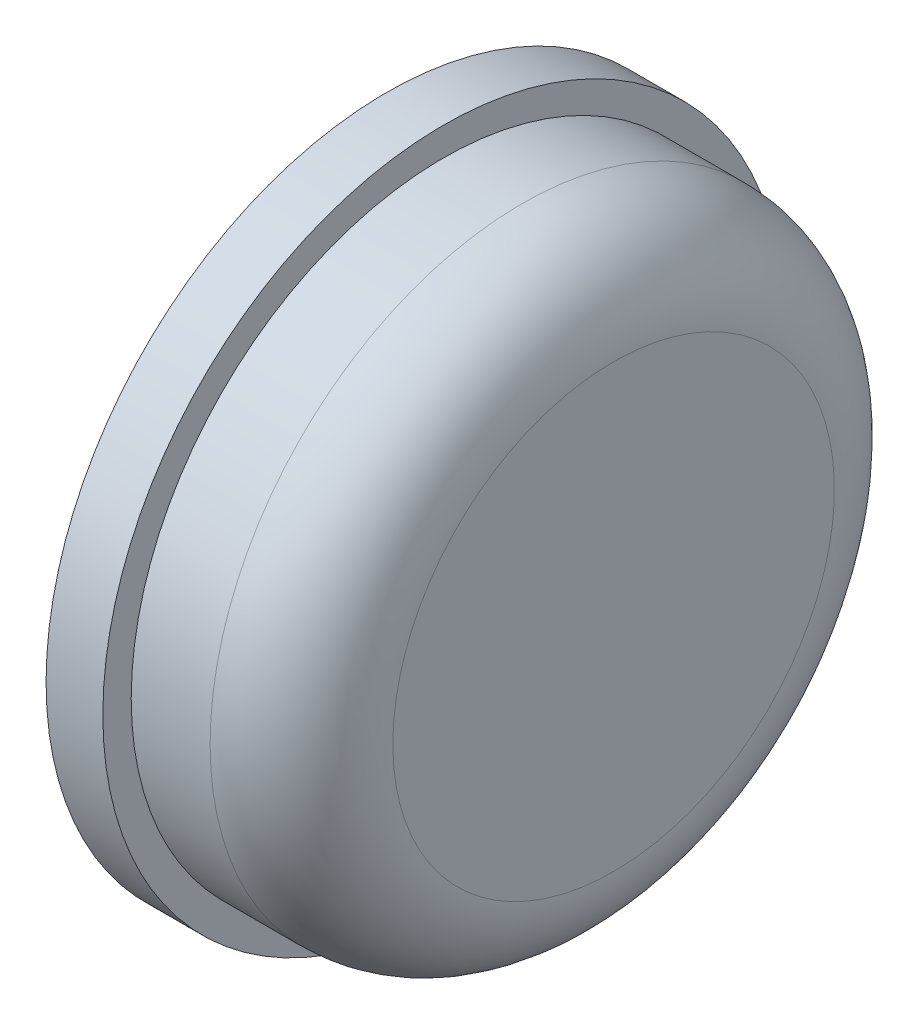
ISO-10303-21;
HEADER;
FILE_DESCRIPTION(('STEP AP214'),'2;1');
FILE_NAME('part.step','',(''),(''),'','','');
FILE_SCHEMA(('AUTOMOTIVE_DESIGN { 1 0 10303 214 1 1 1 1 }'));
ENDSEC;
DATA;
#1=APPLICATION_CONTEXT('core data for automotive mechanical design processes');
#2=APPLICATION_PROTOCOL_DEFINITION('international standard','automotive_design',2000,#1);
#3=PRODUCT_CONTEXT('',#1,'mechanical');
#4=PRODUCT('Part','Part','',(#3));
#5=PRODUCT_RELATED_PRODUCT_CATEGORY('part','',(#4));
#6=PRODUCT_DEFINITION_FORMATION('','',#4);
#7=PRODUCT_DEFINITION_CONTEXT('part definition',#1,'design');
#8=PRODUCT_DEFINITION('design','',#6,#7);
#9=PRODUCT_DEFINITION_SHAPE('','',#8);
#10=(LENGTH_UNIT() NAMED_UNIT(*) SI_UNIT(.MILLI.,.METRE.));
#11=(NAMED_UNIT(*) PLANE_ANGLE_UNIT() SI_UNIT($,.RADIAN.));
#12=(NAMED_UNIT(*) SI_UNIT($,.STERADIAN.) SOLID_ANGLE_UNIT());
#13=UNCERTAINTY_MEASURE_WITH_UNIT(LENGTH_MEASURE(1.E-05),#10,'distance_accuracy_value','');
#14=(GEOMETRIC_REPRESENTATION_CONTEXT(3) GLOBAL_UNCERTAINTY_ASSIGNED_CONTEXT((#13)) GLOBAL_UNIT_ASSIGNED_CONTEXT((#10,
#11,#12)) REPRESENTATION_CONTEXT('',''));
#15=CARTESIAN_POINT('',(0.,0.,0.));
#16=DIRECTION('',(0.,0.,1.));
#17=DIRECTION('',(1.,0.,0.));
#18=AXIS2_PLACEMENT_3D('',#15,#16,#17);
#19=CARTESIAN_POINT('',(-10.5400297619168,0.,0.));
#20=DIRECTION('',(-1.,0.,0.));
#21=DIRECTION('',(0.,0.,1.));
#22=AXIS2_PLACEMENT_3D('',#19,#20,#21);
#23=CONICAL_SURFACE('',#22,8.28554733064869,1.20615294649828);
#24=CARTESIAN_POINT('',(-9.7525545628137,0.,0.));
#25=DIRECTION('',(-1.,0.,0.));
#26=DIRECTION('',(0.,0.,1.));
#27=AXIS2_PLACEMENT_3D('',#24,#25,#26);
#28=CIRCLE('',#27,6.22254625670181);
#29=CARTESIAN_POINT('',(-9.7525545628137,0.,6.22254625670181));
#30=VERTEX_POINT('',#29);
#31=EDGE_CURVE('E10',#30,#30,#28,.T.);
#32=ORIENTED_EDGE('',*,*,#31,.F.);
#33=EDGE_LOOP('',(#32));
#34=FACE_BOUND('',#33,.T.);
#35=CARTESIAN_POINT('',(-10.5400297619168,0.,0.));
#36=DIRECTION('',(-1.,0.,0.));
#37=DIRECTION('',(0.,0.,1.));
#38=AXIS2_PLACEMENT_3D('',#35,#36,#37);
#39=CIRCLE('',#38,8.28554733064869);
#40=CARTESIAN_POINT('',(-10.5400297619168,0.,8.28554733064869));
#41=VERTEX_POINT('',#40);
#42=EDGE_CURVE('E63',#41,#41,#39,.T.);
#43=ORIENTED_EDGE('',*,*,#42,.T.);
#44=EDGE_LOOP('',(#43));
#45=FACE_BOUND('',#44,.T.);
#46=ADVANCED_FACE('F32',(#34,#45),#23,.F.);
#47=CARTESIAN_POINT('',(-17.5979624011993,0.,0.));
#48=DIRECTION('',(-1.,0.,0.));
#49=DIRECTION('',(0.,0.,-1.));
#50=AXIS2_PLACEMENT_3D('',#47,#48,#49);
#51=SPHERICAL_SURFACE('',#50,10.0135161690285);
#52=ORIENTED_EDGE('',*,*,#31,.T.);
#53=EDGE_LOOP('',(#52));
#54=FACE_BOUND('',#53,.T.);
#55=ADVANCED_FACE('F92',(#54),#51,.F.);
#56=CARTESIAN_POINT('',(-2.83902439024601,0.,0.));
#57=DIRECTION('',(1.,0.,0.));
#58=DIRECTION('',(0.,0.,-1.));
#59=AXIS2_PLACEMENT_3D('',#56,#57,#58);
#60=PLANE('',#59);
#61=CARTESIAN_POINT('',(-2.83902439024601,0.,0.));
#62=DIRECTION('',(-1.,0.,0.));
#63=DIRECTION('',(0.,0.,1.));
#64=AXIS2_PLACEMENT_3D('',#61,#62,#63);
#65=CIRCLE('',#64,7.78048780487805);
#66=CARTESIAN_POINT('',(-2.83902439024601,0.,7.78048780487805));
#67=VERTEX_POINT('',#66);
#68=EDGE_CURVE('E38',#67,#67,#65,.T.);
#69=ORIENTED_EDGE('',*,*,#68,.F.);
#70=EDGE_LOOP('',(#69));
#71=FACE_BOUND('',#70,.T.);
#72=ADVANCED_FACE('F97',(#71),#60,.T.);
#73=CARTESIAN_POINT('',(-6.05853658536796,0.,0.));
#74=DIRECTION('',(-1.,0.,0.));
#75=DIRECTION('',(0.,0.,1.));
#76=AXIS2_PLACEMENT_3D('',#73,#74,#75);
#77=TOROIDAL_SURFACE('',#76,7.78048780487805,3.21951219512195);
#78=ORIENTED_EDGE('',*,*,#68,.T.);
#79=EDGE_LOOP('',(#78));
#80=FACE_BOUND('',#79,.T.);
#81=CARTESIAN_POINT('',(-6.05853658536796,0.,0.));
#82=DIRECTION('',(-1.,0.,0.));
#83=DIRECTION('',(0.,0.,1.));
#84=AXIS2_PLACEMENT_3D('',#81,#82,#83);
#85=CIRCLE('',#84,11.);
#86=CARTESIAN_POINT('',(-6.05853658536796,0.,11.));
#87=VERTEX_POINT('',#86);
#88=EDGE_CURVE('E42',#87,#87,#85,.T.);
#89=ORIENTED_EDGE('',*,*,#88,.F.);
#90=EDGE_LOOP('',(#89));
#91=FACE_BOUND('',#90,.T.);
#92=ADVANCED_FACE('F101',(#80,#91),#77,.T.);
#93=CARTESIAN_POINT('',(0.,0.,0.));
#94=DIRECTION('',(-1.,0.,0.));
#95=DIRECTION('',(0.,0.,1.));
#96=AXIS2_PLACEMENT_3D('',#93,#94,#95);
#97=CYLINDRICAL_SURFACE('',#96,11.);
#98=ORIENTED_EDGE('',*,*,#88,.T.);
#99=EDGE_LOOP('',(#98));
#100=FACE_BOUND('',#99,.T.);
#101=CARTESIAN_POINT('',(-8.83902439024601,0.,0.));
#102=DIRECTION('',(-1.,0.,0.));
#103=DIRECTION('',(0.,0.,1.));
#104=AXIS2_PLACEMENT_3D('',#101,#102,#103);
#105=CIRCLE('',#104,11.);
#106=CARTESIAN_POINT('',(-8.83902439024601,0.,11.));
#107=VERTEX_POINT('',#106);
#108=EDGE_CURVE('E46',#107,#107,#105,.T.);
#109=ORIENTED_EDGE('',*,*,#108,.F.);
#110=EDGE_LOOP('',(#109));
#111=FACE_BOUND('',#110,.T.);
#112=ADVANCED_FACE('F107',(#100,#111),#97,.T.);
#113=CARTESIAN_POINT('',(-8.83902439024601,0.,0.));
#114=DIRECTION('',(1.,0.,0.));
#115=DIRECTION('',(0.,0.,-1.));
#116=AXIS2_PLACEMENT_3D('',#113,#114,#115);
#117=PLANE('',#116);
#118=ORIENTED_EDGE('',*,*,#108,.T.);
#119=EDGE_LOOP('',(#118));
#120=FACE_BOUND('',#119,.T.);
#121=CARTESIAN_POINT('',(-8.83902439024601,0.,0.));
#122=DIRECTION('',(-1.,0.,0.));
#123=DIRECTION('',(0.,0.,1.));
#124=AXIS2_PLACEMENT_3D('',#121,#122,#123);
#125=CIRCLE('',#124,12.);
#126=CARTESIAN_POINT('',(-8.83902439024601,0.,12.));
#127=VERTEX_POINT('',#126);
#128=EDGE_CURVE('E51',#127,#127,#125,.T.);
#129=ORIENTED_EDGE('',*,*,#128,.F.);
#130=EDGE_LOOP('',(#129));
#131=FACE_BOUND('',#130,.T.);
#132=ADVANCED_FACE('F88',(#120,#131),#117,.T.);
#133=CARTESIAN_POINT('',(0.,0.,0.));
#134=DIRECTION('',(-1.,0.,0.));
#135=DIRECTION('',(0.,0.,1.));
#136=AXIS2_PLACEMENT_3D('',#133,#134,#135);
#137=CYLINDRICAL_SURFACE('',#136,12.);
#138=ORIENTED_EDGE('',*,*,#128,.T.);
#139=EDGE_LOOP('',(#138));
#140=FACE_BOUND('',#139,.T.);
#141=CARTESIAN_POINT('',(-10.839024390246,0.,0.));
#142=DIRECTION('',(-1.,0.,0.));
#143=DIRECTION('',(0.,0.,1.));
#144=AXIS2_PLACEMENT_3D('',#141,#142,#143);
#145=CIRCLE('',#144,12.);
#146=CARTESIAN_POINT('',(-10.839024390246,0.,12.));
#147=VERTEX_POINT('',#146);
#148=EDGE_CURVE('E54',#147,#147,#145,.T.);
#149=ORIENTED_EDGE('',*,*,#148,.F.);
#150=EDGE_LOOP('',(#149));
#151=FACE_BOUND('',#150,.T.);
#152=ADVANCED_FACE('F82',(#140,#151),#137,.T.);
#153=CARTESIAN_POINT('',(-10.839024390246,0.,0.));
#154=DIRECTION('',(-1.,0.,0.));
#155=DIRECTION('',(0.,0.,1.));
#156=AXIS2_PLACEMENT_3D('',#153,#154,#155);
#157=PLANE('',#156);
#158=ORIENTED_EDGE('',*,*,#148,.T.);
#159=EDGE_LOOP('',(#158));
#160=FACE_BOUND('',#159,.T.);
#161=CARTESIAN_POINT('',(-10.839024390246,0.,0.));
#162=DIRECTION('',(-1.,0.,0.));
#163=DIRECTION('',(0.,0.,1.));
#164=AXIS2_PLACEMENT_3D('',#161,#162,#163);
#165=CIRCLE('',#164,9.97917788681984);
#166=CARTESIAN_POINT('',(-10.839024390246,0.,9.97917788681984));
#167=VERTEX_POINT('',#166);
#168=EDGE_CURVE('E57',#167,#167,#165,.T.);
#169=ORIENTED_EDGE('',*,*,#168,.F.);
#170=EDGE_LOOP('',(#169));
#171=FACE_BOUND('',#170,.T.);
#172=ADVANCED_FACE('F77',(#160,#171),#157,.T.);
#173=CARTESIAN_POINT('',(0.,0.,0.));
#174=DIRECTION('',(-1.,0.,0.));
#175=DIRECTION('',(0.,0.,1.));
#176=AXIS2_PLACEMENT_3D('',#173,#174,#175);
#177=CYLINDRICAL_SURFACE('',#176,9.97917788681984);
#178=CARTESIAN_POINT('',(-9.99958636035178,0.,0.));
#179=DIRECTION('',(-1.,0.,0.));
#180=DIRECTION('',(0.,0.,1.));
#181=AXIS2_PLACEMENT_3D('',#178,#179,#180);
#182=CIRCLE('',#181,9.97917788681984);
#183=CARTESIAN_POINT('',(-9.99958636035178,0.,9.97917788681984));
#184=VERTEX_POINT('',#183);
#185=EDGE_CURVE('E60',#184,#184,#182,.T.);
#186=ORIENTED_EDGE('',*,*,#185,.F.);
#187=EDGE_LOOP('',(#186));
#188=FACE_BOUND('',#187,.T.);
#189=ORIENTED_EDGE('',*,*,#168,.T.);
#190=EDGE_LOOP('',(#189));
#191=FACE_BOUND('',#190,.T.);
#192=ADVANCED_FACE('F71',(#188,#191),#177,.F.);
#193=CARTESIAN_POINT('',(-8.88775401593156,0.,0.));
#194=DIRECTION('',(-1.,0.,0.));
#195=DIRECTION('',(0.,0.,1.));
#196=AXIS2_PLACEMENT_3D('',#193,#194,#195);
#197=TOROIDAL_SURFACE('',#196,8.69134435560077,1.70137778468838);
#198=ORIENTED_EDGE('',*,*,#42,.F.);
#199=EDGE_LOOP('',(#198));
#200=FACE_BOUND('',#199,.T.);
#201=ORIENTED_EDGE('',*,*,#185,.T.);
#202=EDGE_LOOP('',(#201));
#203=FACE_BOUND('',#202,.T.);
#204=ADVANCED_FACE('F68',(#200,#203),#197,.T.);
#205=CLOSED_SHELL('',(#46,#55,#72,#92,#112,#132,#152,#172,#192,#204));
#206=MANIFOLD_SOLID_BREP('B2',#205);
#207=ADVANCED_BREP_SHAPE_REPRESENTATION('',(#18,#206),#14);
#208=SHAPE_DEFINITION_REPRESENTATION(#9,#207);
ENDSEC;
END-ISO-10303-21;
